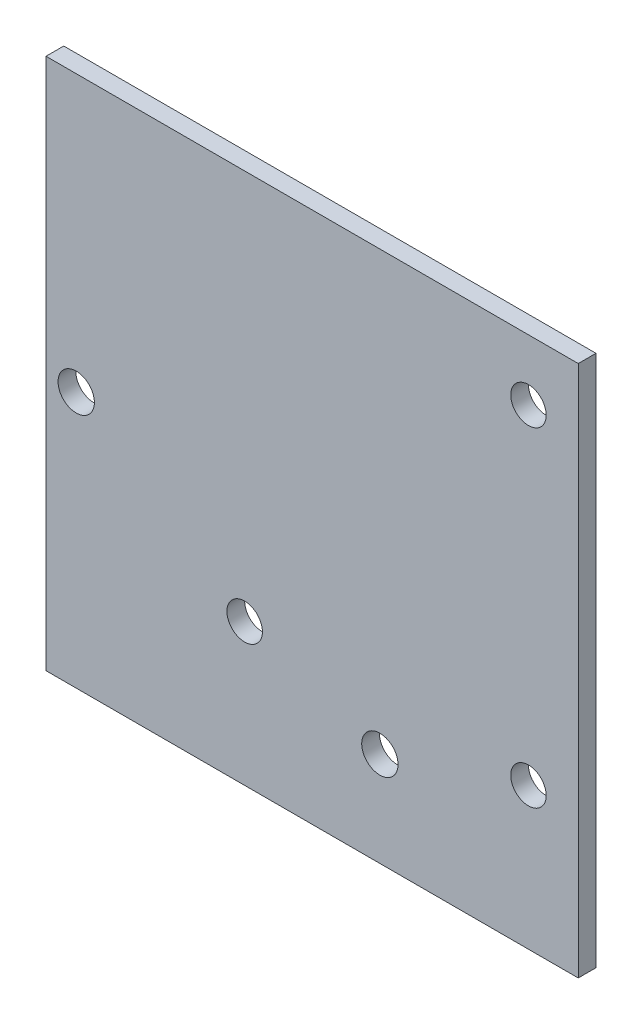
ISO-10303-21;
HEADER;
FILE_DESCRIPTION(('STEP AP214'),'2;1');
FILE_NAME('part.step','',(''),(''),'','','');
FILE_SCHEMA(('AUTOMOTIVE_DESIGN { 1 0 10303 214 1 1 1 1 }'));
ENDSEC;
DATA;
#1=APPLICATION_CONTEXT('core data for automotive mechanical design processes');
#2=APPLICATION_PROTOCOL_DEFINITION('international standard','automotive_design',2000,#1);
#3=PRODUCT_CONTEXT('',#1,'mechanical');
#4=PRODUCT('Part','Part','',(#3));
#5=PRODUCT_RELATED_PRODUCT_CATEGORY('part','',(#4));
#6=PRODUCT_DEFINITION_FORMATION('','',#4);
#7=PRODUCT_DEFINITION_CONTEXT('part definition',#1,'design');
#8=PRODUCT_DEFINITION('design','',#6,#7);
#9=PRODUCT_DEFINITION_SHAPE('','',#8);
#10=(LENGTH_UNIT() NAMED_UNIT(*) SI_UNIT(.MILLI.,.METRE.));
#11=(NAMED_UNIT(*) PLANE_ANGLE_UNIT() SI_UNIT($,.RADIAN.));
#12=(NAMED_UNIT(*) SI_UNIT($,.STERADIAN.) SOLID_ANGLE_UNIT());
#13=UNCERTAINTY_MEASURE_WITH_UNIT(LENGTH_MEASURE(1.E-05),#10,'distance_accuracy_value','');
#14=(GEOMETRIC_REPRESENTATION_CONTEXT(3) GLOBAL_UNCERTAINTY_ASSIGNED_CONTEXT((#13)) GLOBAL_UNIT_ASSIGNED_CONTEXT((#10,
#11,#12)) REPRESENTATION_CONTEXT('',''));
#15=CARTESIAN_POINT('',(0.,0.,0.));
#16=DIRECTION('',(0.,0.,1.));
#17=DIRECTION('',(1.,0.,0.));
#18=AXIS2_PLACEMENT_3D('',#15,#16,#17);
#19=CARTESIAN_POINT('',(0.,0.,3.175));
#20=DIRECTION('',(0.,0.,-1.));
#21=DIRECTION('',(-1.,0.,0.));
#22=AXIS2_PLACEMENT_3D('',#19,#20,#21);
#23=PLANE('',#22);
#24=DIRECTION('',(0.,1.,0.));
#25=VECTOR('',#24,1.);
#26=CARTESIAN_POINT('',(-16.4859703103986,187.785837921012,3.175));
#27=LINE('',#26,#25);
#28=CARTESIAN_POINT('',(-16.4859703103985,92.5285714285711,3.175));
#29=VERTEX_POINT('',#28);
#30=CARTESIAN_POINT('',(-16.4859703103986,187.785837921012,3.175));
#31=VERTEX_POINT('',#30);
#32=EDGE_CURVE('E91',#29,#31,#27,.T.);
#33=ORIENTED_EDGE('',*,*,#32,.T.);
#34=DIRECTION('',(-1.,0.,0.));
#35=VECTOR('',#34,1.);
#36=CARTESIAN_POINT('',(-16.4859703103986,187.785837921012,3.175));
#37=LINE('',#36,#35);
#38=CARTESIAN_POINT('',(-111.76,187.785837921012,3.175));
#39=VERTEX_POINT('',#38);
#40=EDGE_CURVE('E86',#31,#39,#37,.T.);
#41=ORIENTED_EDGE('',*,*,#40,.T.);
#42=DIRECTION('',(0.,-1.,0.));
#43=VECTOR('',#42,1.);
#44=CARTESIAN_POINT('',(-111.76,187.785837921012,3.175));
#45=LINE('',#44,#43);
#46=CARTESIAN_POINT('',(-111.76,92.5285714285711,3.175));
#47=VERTEX_POINT('',#46);
#48=EDGE_CURVE('E89',#39,#47,#45,.T.);
#49=ORIENTED_EDGE('',*,*,#48,.T.);
#50=DIRECTION('',(1.,0.,0.));
#51=VECTOR('',#50,1.);
#52=CARTESIAN_POINT('',(-16.4859703103985,92.5285714285711,3.175));
#53=LINE('',#52,#51);
#54=EDGE_CURVE('E56',#47,#29,#53,.T.);
#55=ORIENTED_EDGE('',*,*,#54,.T.);
#56=EDGE_LOOP('',(#33,#41,#49,#55));
#57=FACE_BOUND('',#56,.T.);
#58=CARTESIAN_POINT('',(-25.4000000000006,176.892857142857,3.175));
#59=DIRECTION('',(0.,0.,1.));
#60=DIRECTION('',(1.,0.,0.));
#61=AXIS2_PLACEMENT_3D('',#58,#59,#60);
#62=CIRCLE('',#61,3.17499999999998);
#63=CARTESIAN_POINT('',(-22.2250000000006,176.892857142857,3.175));
#64=VERTEX_POINT('',#63);
#65=EDGE_CURVE('E106',#64,#64,#62,.T.);
#66=ORIENTED_EDGE('',*,*,#65,.F.);
#67=EDGE_LOOP('',(#66));
#68=FACE_BOUND('',#67,.T.);
#69=CARTESIAN_POINT('',(-25.4000000000004,117.928571428571,3.175));
#70=DIRECTION('',(0.,0.,1.));
#71=DIRECTION('',(1.,0.,0.));
#72=AXIS2_PLACEMENT_3D('',#69,#70,#71);
#73=CIRCLE('',#72,3.17499999999999);
#74=CARTESIAN_POINT('',(-22.2250000000004,117.928571428571,3.175));
#75=VERTEX_POINT('',#74);
#76=EDGE_CURVE('E121',#75,#75,#73,.T.);
#77=ORIENTED_EDGE('',*,*,#76,.F.);
#78=EDGE_LOOP('',(#77));
#79=FACE_BOUND('',#78,.T.);
#80=CARTESIAN_POINT('',(-76.2000000000004,117.928571428571,3.175));
#81=DIRECTION('',(0.,0.,1.));
#82=DIRECTION('',(1.,0.,0.));
#83=AXIS2_PLACEMENT_3D('',#80,#81,#82);
#84=CIRCLE('',#83,3.175);
#85=CARTESIAN_POINT('',(-73.0250000000004,117.928571428571,3.175));
#86=VERTEX_POINT('',#85);
#87=EDGE_CURVE('E127',#86,#86,#84,.T.);
#88=ORIENTED_EDGE('',*,*,#87,.F.);
#89=EDGE_LOOP('',(#88));
#90=FACE_BOUND('',#89,.T.);
#91=CARTESIAN_POINT('',(-51.9979450252838,109.474,3.175));
#92=DIRECTION('',(0.,0.,1.));
#93=DIRECTION('',(1.,0.,0.));
#94=AXIS2_PLACEMENT_3D('',#91,#92,#93);
#95=CIRCLE('',#94,3.2512);
#96=CARTESIAN_POINT('',(-48.7467450252838,109.474,3.175));
#97=VERTEX_POINT('',#96);
#98=EDGE_CURVE('E133',#97,#97,#95,.T.);
#99=ORIENTED_EDGE('',*,*,#98,.F.);
#100=EDGE_LOOP('',(#99));
#101=FACE_BOUND('',#100,.T.);
#102=CARTESIAN_POINT('',(-106.353945025284,138.43,3.175));
#103=DIRECTION('',(0.,0.,1.));
#104=DIRECTION('',(1.,0.,0.));
#105=AXIS2_PLACEMENT_3D('',#102,#103,#104);
#106=CIRCLE('',#105,3.25119999999999);
#107=CARTESIAN_POINT('',(-103.102745025284,138.43,3.175));
#108=VERTEX_POINT('',#107);
#109=EDGE_CURVE('E139',#108,#108,#106,.T.);
#110=ORIENTED_EDGE('',*,*,#109,.F.);
#111=EDGE_LOOP('',(#110));
#112=FACE_BOUND('',#111,.T.);
#113=ADVANCED_FACE('F39',(#57,#68,#79,#90,#101,#112),#23,.F.);
#114=CARTESIAN_POINT('',(0.,0.,0.));
#115=DIRECTION('',(0.,0.,-1.));
#116=DIRECTION('',(-1.,0.,0.));
#117=AXIS2_PLACEMENT_3D('',#114,#115,#116);
#118=PLANE('',#117);
#119=CARTESIAN_POINT('',(-51.9979450252838,109.474,0.));
#120=DIRECTION('',(0.,0.,1.));
#121=DIRECTION('',(1.,0.,0.));
#122=AXIS2_PLACEMENT_3D('',#119,#120,#121);
#123=CIRCLE('',#122,3.2512);
#124=CARTESIAN_POINT('',(-48.7467450252838,109.474,0.));
#125=VERTEX_POINT('',#124);
#126=EDGE_CURVE('E136',#125,#125,#123,.T.);
#127=ORIENTED_EDGE('',*,*,#126,.T.);
#128=EDGE_LOOP('',(#127));
#129=FACE_BOUND('',#128,.T.);
#130=CARTESIAN_POINT('',(-25.4000000000004,117.928571428571,0.));
#131=DIRECTION('',(0.,0.,1.));
#132=DIRECTION('',(1.,0.,0.));
#133=AXIS2_PLACEMENT_3D('',#130,#131,#132);
#134=CIRCLE('',#133,3.17499999999999);
#135=CARTESIAN_POINT('',(-22.2250000000004,117.928571428571,0.));
#136=VERTEX_POINT('',#135);
#137=EDGE_CURVE('E124',#136,#136,#134,.T.);
#138=ORIENTED_EDGE('',*,*,#137,.T.);
#139=EDGE_LOOP('',(#138));
#140=FACE_BOUND('',#139,.T.);
#141=DIRECTION('',(0.,1.,0.));
#142=VECTOR('',#141,1.);
#143=CARTESIAN_POINT('',(-16.4859703103986,187.785837921012,0.));
#144=LINE('',#143,#142);
#145=CARTESIAN_POINT('',(-16.4859703103985,92.5285714285711,0.));
#146=VERTEX_POINT('',#145);
#147=CARTESIAN_POINT('',(-16.4859703103986,187.785837921012,0.));
#148=VERTEX_POINT('',#147);
#149=EDGE_CURVE('E103',#146,#148,#144,.T.);
#150=ORIENTED_EDGE('',*,*,#149,.F.);
#151=DIRECTION('',(1.,0.,0.));
#152=VECTOR('',#151,1.);
#153=CARTESIAN_POINT('',(-16.4859703103985,92.5285714285711,0.));
#154=LINE('',#153,#152);
#155=CARTESIAN_POINT('',(-111.76,92.5285714285711,0.));
#156=VERTEX_POINT('',#155);
#157=EDGE_CURVE('E79',#156,#146,#154,.T.);
#158=ORIENTED_EDGE('',*,*,#157,.F.);
#159=DIRECTION('',(0.,-1.,0.));
#160=VECTOR('',#159,1.);
#161=CARTESIAN_POINT('',(-111.76,187.785837921012,0.));
#162=LINE('',#161,#160);
#163=CARTESIAN_POINT('',(-111.76,187.785837921012,0.));
#164=VERTEX_POINT('',#163);
#165=EDGE_CURVE('E73',#164,#156,#162,.T.);
#166=ORIENTED_EDGE('',*,*,#165,.F.);
#167=DIRECTION('',(-1.,0.,0.));
#168=VECTOR('',#167,1.);
#169=CARTESIAN_POINT('',(-16.4859703103986,187.785837921012,0.));
#170=LINE('',#169,#168);
#171=EDGE_CURVE('E95',#148,#164,#170,.T.);
#172=ORIENTED_EDGE('',*,*,#171,.F.);
#173=EDGE_LOOP('',(#150,#158,#166,#172));
#174=FACE_BOUND('',#173,.T.);
#175=CARTESIAN_POINT('',(-25.4000000000006,176.892857142857,0.));
#176=DIRECTION('',(0.,0.,1.));
#177=DIRECTION('',(1.,0.,0.));
#178=AXIS2_PLACEMENT_3D('',#175,#176,#177);
#179=CIRCLE('',#178,3.17499999999998);
#180=CARTESIAN_POINT('',(-22.2250000000006,176.892857142857,0.));
#181=VERTEX_POINT('',#180);
#182=EDGE_CURVE('E118',#181,#181,#179,.T.);
#183=ORIENTED_EDGE('',*,*,#182,.T.);
#184=EDGE_LOOP('',(#183));
#185=FACE_BOUND('',#184,.T.);
#186=CARTESIAN_POINT('',(-76.2000000000004,117.928571428571,0.));
#187=DIRECTION('',(0.,0.,1.));
#188=DIRECTION('',(1.,0.,0.));
#189=AXIS2_PLACEMENT_3D('',#186,#187,#188);
#190=CIRCLE('',#189,3.175);
#191=CARTESIAN_POINT('',(-73.0250000000004,117.928571428571,0.));
#192=VERTEX_POINT('',#191);
#193=EDGE_CURVE('E130',#192,#192,#190,.T.);
#194=ORIENTED_EDGE('',*,*,#193,.T.);
#195=EDGE_LOOP('',(#194));
#196=FACE_BOUND('',#195,.T.);
#197=CARTESIAN_POINT('',(-106.353945025284,138.43,0.));
#198=DIRECTION('',(0.,0.,1.));
#199=DIRECTION('',(1.,0.,0.));
#200=AXIS2_PLACEMENT_3D('',#197,#198,#199);
#201=CIRCLE('',#200,3.25119999999999);
#202=CARTESIAN_POINT('',(-103.102745025284,138.43,0.));
#203=VERTEX_POINT('',#202);
#204=EDGE_CURVE('E142',#203,#203,#201,.T.);
#205=ORIENTED_EDGE('',*,*,#204,.T.);
#206=EDGE_LOOP('',(#205));
#207=FACE_BOUND('',#206,.T.);
#208=ADVANCED_FACE('F114',(#129,#140,#174,#185,#196,#207),#118,.T.);
#209=CARTESIAN_POINT('',(-16.4859703103986,187.785837921012,3.175));
#210=DIRECTION('',(-1.,0.,0.));
#211=DIRECTION('',(0.,-1.,0.));
#212=AXIS2_PLACEMENT_3D('',#209,#210,#211);
#213=PLANE('',#212);
#214=ORIENTED_EDGE('',*,*,#149,.T.);
#215=DIRECTION('',(0.,0.,-1.));
#216=VECTOR('',#215,1.);
#217=CARTESIAN_POINT('',(-16.4859703103986,187.785837921012,3.175));
#218=LINE('',#217,#216);
#219=EDGE_CURVE('E11',#31,#148,#218,.T.);
#220=ORIENTED_EDGE('',*,*,#219,.F.);
#221=ORIENTED_EDGE('',*,*,#32,.F.);
#222=DIRECTION('',(0.,0.,-1.));
#223=VECTOR('',#222,1.);
#224=CARTESIAN_POINT('',(-16.4859703103985,92.5285714285711,3.175));
#225=LINE('',#224,#223);
#226=EDGE_CURVE('E99',#29,#146,#225,.T.);
#227=ORIENTED_EDGE('',*,*,#226,.T.);
#228=EDGE_LOOP('',(#214,#220,#221,#227));
#229=FACE_BOUND('',#228,.T.);
#230=ADVANCED_FACE('F41',(#229),#213,.F.);
#231=CARTESIAN_POINT('',(-16.4859703103986,187.785837921012,3.175));
#232=DIRECTION('',(0.,-1.,0.));
#233=DIRECTION('',(0.,0.,-1.));
#234=AXIS2_PLACEMENT_3D('',#231,#232,#233);
#235=PLANE('',#234);
#236=ORIENTED_EDGE('',*,*,#171,.T.);
#237=DIRECTION('',(0.,0.,-1.));
#238=VECTOR('',#237,1.);
#239=CARTESIAN_POINT('',(-111.76,187.785837921012,3.175));
#240=LINE('',#239,#238);
#241=EDGE_CURVE('E48',#39,#164,#240,.T.);
#242=ORIENTED_EDGE('',*,*,#241,.F.);
#243=ORIENTED_EDGE('',*,*,#40,.F.);
#244=ORIENTED_EDGE('',*,*,#219,.T.);
#245=EDGE_LOOP('',(#236,#242,#243,#244));
#246=FACE_BOUND('',#245,.T.);
#247=ADVANCED_FACE('F94',(#246),#235,.F.);
#248=CARTESIAN_POINT('',(-111.76,187.785837921012,3.175));
#249=DIRECTION('',(1.,0.,0.));
#250=DIRECTION('',(0.,1.,0.));
#251=AXIS2_PLACEMENT_3D('',#248,#249,#250);
#252=PLANE('',#251);
#253=ORIENTED_EDGE('',*,*,#165,.T.);
#254=DIRECTION('',(0.,0.,-1.));
#255=VECTOR('',#254,1.);
#256=CARTESIAN_POINT('',(-111.76,92.5285714285711,3.175));
#257=LINE('',#256,#255);
#258=EDGE_CURVE('E96',#47,#156,#257,.T.);
#259=ORIENTED_EDGE('',*,*,#258,.F.);
#260=ORIENTED_EDGE('',*,*,#48,.F.);
#261=ORIENTED_EDGE('',*,*,#241,.T.);
#262=EDGE_LOOP('',(#253,#259,#260,#261));
#263=FACE_BOUND('',#262,.T.);
#264=ADVANCED_FACE('F97',(#263),#252,.F.);
#265=CARTESIAN_POINT('',(-16.4859703103985,92.5285714285711,3.175));
#266=DIRECTION('',(0.,1.,0.));
#267=DIRECTION('',(-1.,0.,0.));
#268=AXIS2_PLACEMENT_3D('',#265,#266,#267);
#269=PLANE('',#268);
#270=ORIENTED_EDGE('',*,*,#157,.T.);
#271=ORIENTED_EDGE('',*,*,#226,.F.);
#272=ORIENTED_EDGE('',*,*,#54,.F.);
#273=ORIENTED_EDGE('',*,*,#258,.T.);
#274=EDGE_LOOP('',(#270,#271,#272,#273));
#275=FACE_BOUND('',#274,.T.);
#276=ADVANCED_FACE('F111',(#275),#269,.F.);
#277=CARTESIAN_POINT('',(-25.4000000000006,176.892857142857,3.175));
#278=DIRECTION('',(0.,0.,-1.));
#279=DIRECTION('',(-1.,0.,0.));
#280=AXIS2_PLACEMENT_3D('',#277,#278,#279);
#281=CYLINDRICAL_SURFACE('',#280,3.17499999999998);
#282=ORIENTED_EDGE('',*,*,#65,.T.);
#283=EDGE_LOOP('',(#282));
#284=FACE_BOUND('',#283,.T.);
#285=ORIENTED_EDGE('',*,*,#182,.F.);
#286=EDGE_LOOP('',(#285));
#287=FACE_BOUND('',#286,.T.);
#288=ADVANCED_FACE('F159',(#284,#287),#281,.F.);
#289=CARTESIAN_POINT('',(-25.4000000000004,117.928571428571,3.175));
#290=DIRECTION('',(0.,0.,-1.));
#291=DIRECTION('',(-1.,0.,0.));
#292=AXIS2_PLACEMENT_3D('',#289,#290,#291);
#293=CYLINDRICAL_SURFACE('',#292,3.17499999999999);
#294=ORIENTED_EDGE('',*,*,#76,.T.);
#295=EDGE_LOOP('',(#294));
#296=FACE_BOUND('',#295,.T.);
#297=ORIENTED_EDGE('',*,*,#137,.F.);
#298=EDGE_LOOP('',(#297));
#299=FACE_BOUND('',#298,.T.);
#300=ADVANCED_FACE('F227',(#296,#299),#293,.F.);
#301=CARTESIAN_POINT('',(-76.2000000000004,117.928571428571,3.175));
#302=DIRECTION('',(0.,0.,-1.));
#303=DIRECTION('',(-1.,0.,0.));
#304=AXIS2_PLACEMENT_3D('',#301,#302,#303);
#305=CYLINDRICAL_SURFACE('',#304,3.175);
#306=ORIENTED_EDGE('',*,*,#87,.T.);
#307=EDGE_LOOP('',(#306));
#308=FACE_BOUND('',#307,.T.);
#309=ORIENTED_EDGE('',*,*,#193,.F.);
#310=EDGE_LOOP('',(#309));
#311=FACE_BOUND('',#310,.T.);
#312=ADVANCED_FACE('F238',(#308,#311),#305,.F.);
#313=CARTESIAN_POINT('',(-51.9979450252838,109.474,3.175));
#314=DIRECTION('',(0.,0.,-1.));
#315=DIRECTION('',(-1.,0.,0.));
#316=AXIS2_PLACEMENT_3D('',#313,#314,#315);
#317=CYLINDRICAL_SURFACE('',#316,3.2512);
#318=ORIENTED_EDGE('',*,*,#98,.T.);
#319=EDGE_LOOP('',(#318));
#320=FACE_BOUND('',#319,.T.);
#321=ORIENTED_EDGE('',*,*,#126,.F.);
#322=EDGE_LOOP('',(#321));
#323=FACE_BOUND('',#322,.T.);
#324=ADVANCED_FACE('F249',(#320,#323),#317,.F.);
#325=CARTESIAN_POINT('',(-106.353945025284,138.43,3.175));
#326=DIRECTION('',(0.,0.,-1.));
#327=DIRECTION('',(-1.,0.,0.));
#328=AXIS2_PLACEMENT_3D('',#325,#326,#327);
#329=CYLINDRICAL_SURFACE('',#328,3.25119999999999);
#330=ORIENTED_EDGE('',*,*,#109,.T.);
#331=EDGE_LOOP('',(#330));
#332=FACE_BOUND('',#331,.T.);
#333=ORIENTED_EDGE('',*,*,#204,.F.);
#334=EDGE_LOOP('',(#333));
#335=FACE_BOUND('',#334,.T.);
#336=ADVANCED_FACE('F148',(#332,#335),#329,.F.);
#337=CLOSED_SHELL('',(#113,#208,#230,#247,#264,#276,#288,#300,#312,#324,#336));
#338=MANIFOLD_SOLID_BREP('B2',#337);
#339=ADVANCED_BREP_SHAPE_REPRESENTATION('',(#18,#338),#14);
#340=SHAPE_DEFINITION_REPRESENTATION(#9,#339);
ENDSEC;
END-ISO-10303-21;
